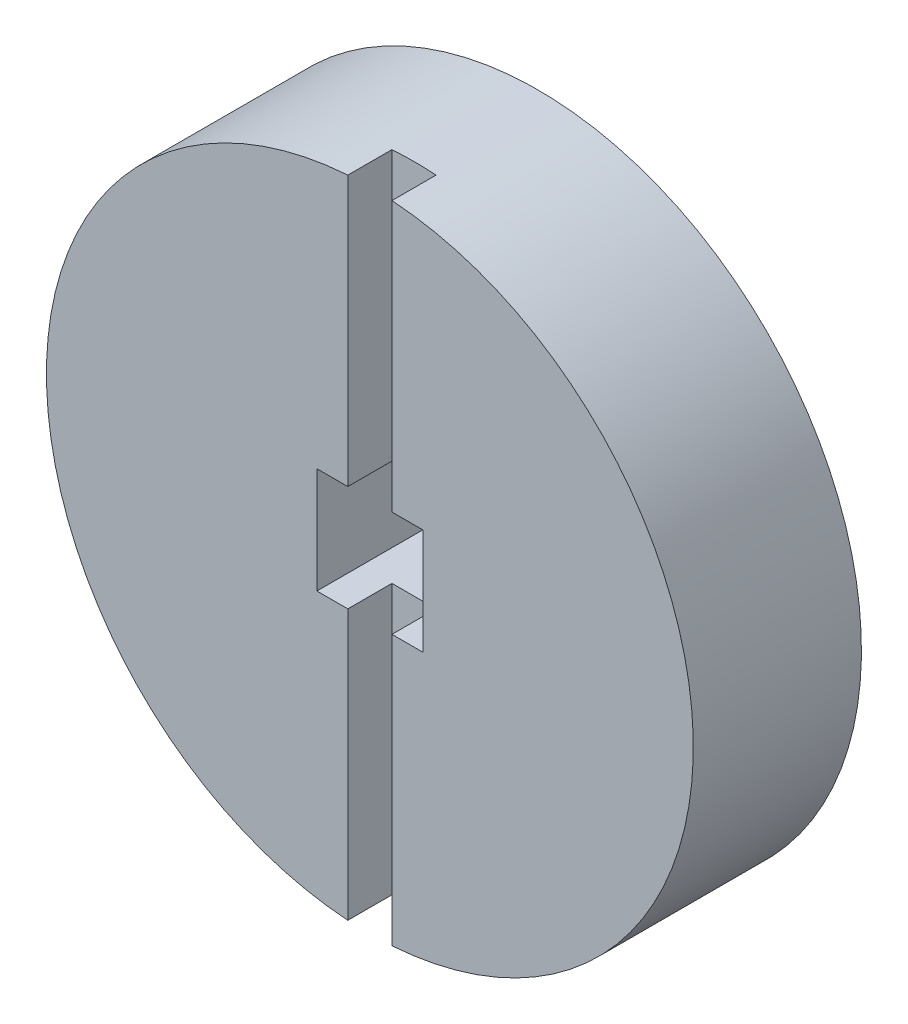
ISO-10303-21;
HEADER;
FILE_DESCRIPTION(('STEP AP214'),'2;1');
FILE_NAME('part.step','',(''),(''),'','','');
FILE_SCHEMA(('AUTOMOTIVE_DESIGN { 1 0 10303 214 1 1 1 1 }'));
ENDSEC;
DATA;
#1=APPLICATION_CONTEXT('core data for automotive mechanical design processes');
#2=APPLICATION_PROTOCOL_DEFINITION('international standard','automotive_design',2000,#1);
#3=PRODUCT_CONTEXT('',#1,'mechanical');
#4=PRODUCT('Part','Part','',(#3));
#5=PRODUCT_RELATED_PRODUCT_CATEGORY('part','',(#4));
#6=PRODUCT_DEFINITION_FORMATION('','',#4);
#7=PRODUCT_DEFINITION_CONTEXT('part definition',#1,'design');
#8=PRODUCT_DEFINITION('design','',#6,#7);
#9=PRODUCT_DEFINITION_SHAPE('','',#8);
#10=(LENGTH_UNIT() NAMED_UNIT(*) SI_UNIT(.MILLI.,.METRE.));
#11=(NAMED_UNIT(*) PLANE_ANGLE_UNIT() SI_UNIT($,.RADIAN.));
#12=(NAMED_UNIT(*) SI_UNIT($,.STERADIAN.) SOLID_ANGLE_UNIT());
#13=UNCERTAINTY_MEASURE_WITH_UNIT(LENGTH_MEASURE(1.E-05),#10,'distance_accuracy_value','');
#14=(GEOMETRIC_REPRESENTATION_CONTEXT(3) GLOBAL_UNCERTAINTY_ASSIGNED_CONTEXT((#13)) GLOBAL_UNIT_ASSIGNED_CONTEXT((#10,
#11,#12)) REPRESENTATION_CONTEXT('',''));
#15=CARTESIAN_POINT('',(0.,0.,0.));
#16=DIRECTION('',(0.,0.,1.));
#17=DIRECTION('',(1.,0.,0.));
#18=AXIS2_PLACEMENT_3D('',#15,#16,#17);
#19=CARTESIAN_POINT('',(24.548886356747,5.38318285887093,-15.875));
#20=DIRECTION('',(0.,0.,-1.));
#21=DIRECTION('',(-1.,0.,0.));
#22=AXIS2_PLACEMENT_3D('',#19,#20,#21);
#23=PLANE('',#22);
#24=CARTESIAN_POINT('',(24.548886356747,5.38318285887093,-15.875));
#25=DIRECTION('',(0.,0.,-1.));
#26=DIRECTION('',(-1.,0.,0.));
#27=AXIS2_PLACEMENT_3D('',#24,#25,#26);
#28=CIRCLE('',#27,7.32907681011146);
#29=CARTESIAN_POINT('',(25.048886356747,12.6951844240044,-15.875));
#30=VERTEX_POINT('',#29);
#31=CARTESIAN_POINT('',(25.048886356747,-1.92881870626249,-15.875));
#32=VERTEX_POINT('',#31);
#33=EDGE_CURVE('E136',#30,#32,#28,.T.);
#34=ORIENTED_EDGE('',*,*,#33,.F.);
#35=DIRECTION('',(0.,1.,0.));
#36=VECTOR('',#35,1.);
#37=CARTESIAN_POINT('',(25.048886356747,16.6967615975721,-15.875));
#38=LINE('',#37,#36);
#39=CARTESIAN_POINT('',(25.048886356747,6.58318285887093,-15.875));
#40=VERTEX_POINT('',#39);
#41=EDGE_CURVE('E140',#40,#30,#38,.T.);
#42=ORIENTED_EDGE('',*,*,#41,.F.);
#43=DIRECTION('',(-1.,0.,0.));
#44=VECTOR('',#43,1.);
#45=CARTESIAN_POINT('',(23.348886356747,6.58318285887093,-15.875));
#46=LINE('',#45,#44);
#47=CARTESIAN_POINT('',(25.748886356747,6.58318285887093,-15.875));
#48=VERTEX_POINT('',#47);
#49=EDGE_CURVE('E174',#48,#40,#46,.T.);
#50=ORIENTED_EDGE('',*,*,#49,.F.);
#51=DIRECTION('',(0.,1.,0.));
#52=VECTOR('',#51,1.);
#53=CARTESIAN_POINT('',(25.748886356747,6.58318285887093,-15.875));
#54=LINE('',#53,#52);
#55=CARTESIAN_POINT('',(25.748886356747,4.18318285887093,-15.875));
#56=VERTEX_POINT('',#55);
#57=EDGE_CURVE('E175',#56,#48,#54,.T.);
#58=ORIENTED_EDGE('',*,*,#57,.F.);
#59=DIRECTION('',(1.,0.,0.));
#60=VECTOR('',#59,1.);
#61=CARTESIAN_POINT('',(23.348886356747,4.18318285887093,-15.875));
#62=LINE('',#61,#60);
#63=CARTESIAN_POINT('',(25.048886356747,4.18318285887093,-15.875));
#64=VERTEX_POINT('',#63);
#65=EDGE_CURVE('E138',#64,#56,#62,.T.);
#66=ORIENTED_EDGE('',*,*,#65,.F.);
#67=EDGE_CURVE('E124',#32,#64,#38,.T.);
#68=ORIENTED_EDGE('',*,*,#67,.F.);
#69=EDGE_LOOP('',(#34,#42,#50,#58,#66,#68));
#70=FACE_BOUND('',#69,.T.);
#71=ADVANCED_FACE('F33',(#70),#23,.F.);
#72=CARTESIAN_POINT('',(24.548886356747,5.38318285887093,-19.695));
#73=DIRECTION('',(0.,0.,1.));
#74=DIRECTION('',(1.,0.,0.));
#75=AXIS2_PLACEMENT_3D('',#72,#73,#74);
#76=CYLINDRICAL_SURFACE('',#75,7.32907681011146);
#77=DIRECTION('',(0.,0.,1.));
#78=VECTOR('',#77,1.);
#79=CARTESIAN_POINT('',(25.048886356747,-1.92881870626249,-19.695));
#80=LINE('',#79,#78);
#81=CARTESIAN_POINT('',(25.048886356747,-1.92881870626249,-16.875));
#82=VERTEX_POINT('',#81);
#83=EDGE_CURVE('E121',#82,#32,#80,.T.);
#84=ORIENTED_EDGE('',*,*,#83,.F.);
#85=CARTESIAN_POINT('',(24.548886356747,5.38318285887093,-16.875));
#86=DIRECTION('',(0.,0.,1.));
#87=DIRECTION('',(1.,0.,0.));
#88=AXIS2_PLACEMENT_3D('',#85,#86,#87);
#89=CIRCLE('',#88,7.32907681011146);
#90=CARTESIAN_POINT('',(24.048886356747,-1.92881870626249,-16.875));
#91=VERTEX_POINT('',#90);
#92=EDGE_CURVE('E216',#82,#91,#89,.F.);
#93=ORIENTED_EDGE('',*,*,#92,.T.);
#94=DIRECTION('',(0.,0.,1.));
#95=VECTOR('',#94,1.);
#96=CARTESIAN_POINT('',(24.048886356747,-1.92881870626249,-19.695));
#97=LINE('',#96,#95);
#98=CARTESIAN_POINT('',(24.048886356747,-1.92881870626249,-15.875));
#99=VERTEX_POINT('',#98);
#100=EDGE_CURVE('E209',#99,#91,#97,.F.);
#101=ORIENTED_EDGE('',*,*,#100,.F.);
#102=CARTESIAN_POINT('',(24.048886356747,12.6951844240044,-15.875));
#103=VERTEX_POINT('',#102);
#104=EDGE_CURVE('E147',#99,#103,#28,.T.);
#105=ORIENTED_EDGE('',*,*,#104,.T.);
#106=DIRECTION('',(0.,0.,1.));
#107=VECTOR('',#106,1.);
#108=CARTESIAN_POINT('',(24.048886356747,12.6951844240044,-19.695));
#109=LINE('',#108,#107);
#110=CARTESIAN_POINT('',(24.048886356747,12.6951844240044,-16.875));
#111=VERTEX_POINT('',#110);
#112=EDGE_CURVE('E211',#111,#103,#109,.T.);
#113=ORIENTED_EDGE('',*,*,#112,.F.);
#114=CARTESIAN_POINT('',(25.048886356747,12.6951844240044,-16.875));
#115=VERTEX_POINT('',#114);
#116=EDGE_CURVE('E217',#111,#115,#89,.F.);
#117=ORIENTED_EDGE('',*,*,#116,.T.);
#118=DIRECTION('',(0.,0.,1.));
#119=VECTOR('',#118,1.);
#120=CARTESIAN_POINT('',(25.048886356747,12.6951844240044,-19.695));
#121=LINE('',#120,#119);
#122=EDGE_CURVE('E129',#30,#115,#121,.F.);
#123=ORIENTED_EDGE('',*,*,#122,.F.);
#124=ORIENTED_EDGE('',*,*,#33,.T.);
#125=EDGE_LOOP('',(#84,#93,#101,#105,#113,#117,#123,#124));
#126=FACE_BOUND('',#125,.T.);
#127=CARTESIAN_POINT('',(24.548886356747,5.38318285887093,-19.685));
#128=DIRECTION('',(0.,0.,-1.));
#129=DIRECTION('',(-1.,0.,0.));
#130=AXIS2_PLACEMENT_3D('',#127,#128,#129);
#131=CIRCLE('',#130,7.32907681011146);
#132=CARTESIAN_POINT('',(17.2198095466355,5.38318285887093,-19.685));
#133=VERTEX_POINT('',#132);
#134=EDGE_CURVE('E146',#133,#133,#131,.T.);
#135=ORIENTED_EDGE('',*,*,#134,.F.);
#136=EDGE_LOOP('',(#135));
#137=FACE_BOUND('',#136,.T.);
#138=ADVANCED_FACE('F143',(#126,#137),#76,.T.);
#139=ORIENTED_EDGE('',*,*,#104,.F.);
#140=DIRECTION('',(0.,-1.,0.));
#141=VECTOR('',#140,1.);
#142=CARTESIAN_POINT('',(24.048886356747,16.6967615975721,-15.875));
#143=LINE('',#142,#141);
#144=CARTESIAN_POINT('',(24.048886356747,4.18318285887093,-15.875));
#145=VERTEX_POINT('',#144);
#146=EDGE_CURVE('E139',#145,#99,#143,.T.);
#147=ORIENTED_EDGE('',*,*,#146,.F.);
#148=CARTESIAN_POINT('',(23.348886356747,4.18318285887093,-15.875));
#149=VERTEX_POINT('',#148);
#150=EDGE_CURVE('E181',#149,#145,#62,.T.);
#151=ORIENTED_EDGE('',*,*,#150,.F.);
#152=DIRECTION('',(0.,-1.,0.));
#153=VECTOR('',#152,1.);
#154=CARTESIAN_POINT('',(23.348886356747,6.58318285887093,-15.875));
#155=LINE('',#154,#153);
#156=CARTESIAN_POINT('',(23.348886356747,6.58318285887093,-15.875));
#157=VERTEX_POINT('',#156);
#158=EDGE_CURVE('E173',#157,#149,#155,.T.);
#159=ORIENTED_EDGE('',*,*,#158,.F.);
#160=CARTESIAN_POINT('',(24.048886356747,6.58318285887093,-15.875));
#161=VERTEX_POINT('',#160);
#162=EDGE_CURVE('E162',#161,#157,#46,.T.);
#163=ORIENTED_EDGE('',*,*,#162,.F.);
#164=EDGE_CURVE('E170',#103,#161,#143,.T.);
#165=ORIENTED_EDGE('',*,*,#164,.F.);
#166=EDGE_LOOP('',(#139,#147,#151,#159,#163,#165));
#167=FACE_BOUND('',#166,.T.);
#168=ADVANCED_FACE('F169',(#167),#23,.F.);
#169=CARTESIAN_POINT('',(24.548886356747,5.38318285887093,-19.685));
#170=DIRECTION('',(0.,0.,-1.));
#171=DIRECTION('',(-1.,0.,0.));
#172=AXIS2_PLACEMENT_3D('',#169,#170,#171);
#173=PLANE('',#172);
#174=ORIENTED_EDGE('',*,*,#134,.T.);
#175=EDGE_LOOP('',(#174));
#176=FACE_BOUND('',#175,.T.);
#177=ADVANCED_FACE('F35',(#176),#173,.T.);
#178=CARTESIAN_POINT('',(25.748886356747,6.58318285887093,-18.796));
#179=DIRECTION('',(1.,0.,0.));
#180=DIRECTION('',(0.,0.,-1.));
#181=AXIS2_PLACEMENT_3D('',#178,#179,#180);
#182=PLANE('',#181);
#183=ORIENTED_EDGE('',*,*,#57,.T.);
#184=DIRECTION('',(0.,0.,1.));
#185=VECTOR('',#184,1.);
#186=CARTESIAN_POINT('',(25.748886356747,6.58318285887093,-18.796));
#187=LINE('',#186,#185);
#188=CARTESIAN_POINT('',(25.748886356747,6.58318285887093,-18.796));
#189=VERTEX_POINT('',#188);
#190=EDGE_CURVE('E190',#189,#48,#187,.T.);
#191=ORIENTED_EDGE('',*,*,#190,.F.);
#192=DIRECTION('',(0.,1.,0.));
#193=VECTOR('',#192,1.);
#194=CARTESIAN_POINT('',(25.748886356747,6.58318285887093,-18.796));
#195=LINE('',#194,#193);
#196=CARTESIAN_POINT('',(25.748886356747,4.18318285887093,-18.796));
#197=VERTEX_POINT('',#196);
#198=EDGE_CURVE('E184',#197,#189,#195,.T.);
#199=ORIENTED_EDGE('',*,*,#198,.F.);
#200=DIRECTION('',(0.,0.,1.));
#201=VECTOR('',#200,1.);
#202=CARTESIAN_POINT('',(25.748886356747,4.18318285887093,-18.796));
#203=LINE('',#202,#201);
#204=EDGE_CURVE('E153',#197,#56,#203,.T.);
#205=ORIENTED_EDGE('',*,*,#204,.T.);
#206=EDGE_LOOP('',(#183,#191,#199,#205));
#207=FACE_BOUND('',#206,.T.);
#208=ADVANCED_FACE('F242',(#207),#182,.F.);
#209=CARTESIAN_POINT('',(23.348886356747,4.18318285887093,-18.796));
#210=DIRECTION('',(0.,-1.,0.));
#211=DIRECTION('',(0.,0.,-1.));
#212=AXIS2_PLACEMENT_3D('',#209,#210,#211);
#213=PLANE('',#212);
#214=DIRECTION('',(-1.,0.,0.));
#215=VECTOR('',#214,1.);
#216=CARTESIAN_POINT('',(23.348886356747,4.18318285887093,-16.875));
#217=LINE('',#216,#215);
#218=CARTESIAN_POINT('',(25.048886356747,4.18318285887093,-16.875));
#219=VERTEX_POINT('',#218);
#220=CARTESIAN_POINT('',(24.048886356747,4.18318285887093,-16.875));
#221=VERTEX_POINT('',#220);
#222=EDGE_CURVE('E219',#219,#221,#217,.T.);
#223=ORIENTED_EDGE('',*,*,#222,.F.);
#224=DIRECTION('',(0.,0.,1.));
#225=VECTOR('',#224,1.);
#226=CARTESIAN_POINT('',(25.048886356747,4.18318285887093,-18.796));
#227=LINE('',#226,#225);
#228=EDGE_CURVE('E130',#219,#64,#227,.T.);
#229=ORIENTED_EDGE('',*,*,#228,.T.);
#230=ORIENTED_EDGE('',*,*,#65,.T.);
#231=ORIENTED_EDGE('',*,*,#204,.F.);
#232=DIRECTION('',(1.,0.,0.));
#233=VECTOR('',#232,1.);
#234=CARTESIAN_POINT('',(23.348886356747,4.18318285887093,-18.796));
#235=LINE('',#234,#233);
#236=CARTESIAN_POINT('',(23.348886356747,4.18318285887093,-18.796));
#237=VERTEX_POINT('',#236);
#238=EDGE_CURVE('E192',#237,#197,#235,.T.);
#239=ORIENTED_EDGE('',*,*,#238,.F.);
#240=DIRECTION('',(0.,0.,1.));
#241=VECTOR('',#240,1.);
#242=CARTESIAN_POINT('',(23.348886356747,4.18318285887093,-18.796));
#243=LINE('',#242,#241);
#244=EDGE_CURVE('E187',#237,#149,#243,.T.);
#245=ORIENTED_EDGE('',*,*,#244,.T.);
#246=ORIENTED_EDGE('',*,*,#150,.T.);
#247=DIRECTION('',(0.,0.,-1.));
#248=VECTOR('',#247,1.);
#249=CARTESIAN_POINT('',(24.048886356747,4.18318285887093,-18.796));
#250=LINE('',#249,#248);
#251=EDGE_CURVE('E213',#145,#221,#250,.T.);
#252=ORIENTED_EDGE('',*,*,#251,.T.);
#253=EDGE_LOOP('',(#223,#229,#230,#231,#239,#245,#246,#252));
#254=FACE_BOUND('',#253,.T.);
#255=ADVANCED_FACE('F235',(#254),#213,.F.);
#256=CARTESIAN_POINT('',(23.348886356747,6.58318285887093,-18.796));
#257=DIRECTION('',(-1.,0.,0.));
#258=DIRECTION('',(0.,0.,1.));
#259=AXIS2_PLACEMENT_3D('',#256,#257,#258);
#260=PLANE('',#259);
#261=ORIENTED_EDGE('',*,*,#158,.T.);
#262=ORIENTED_EDGE('',*,*,#244,.F.);
#263=DIRECTION('',(0.,-1.,0.));
#264=VECTOR('',#263,1.);
#265=CARTESIAN_POINT('',(23.348886356747,6.58318285887093,-18.796));
#266=LINE('',#265,#264);
#267=CARTESIAN_POINT('',(23.348886356747,6.58318285887093,-18.796));
#268=VERTEX_POINT('',#267);
#269=EDGE_CURVE('E196',#268,#237,#266,.T.);
#270=ORIENTED_EDGE('',*,*,#269,.F.);
#271=DIRECTION('',(0.,0.,1.));
#272=VECTOR('',#271,1.);
#273=CARTESIAN_POINT('',(23.348886356747,6.58318285887093,-18.796));
#274=LINE('',#273,#272);
#275=EDGE_CURVE('E189',#268,#157,#274,.T.);
#276=ORIENTED_EDGE('',*,*,#275,.T.);
#277=EDGE_LOOP('',(#261,#262,#270,#276));
#278=FACE_BOUND('',#277,.T.);
#279=ADVANCED_FACE('F238',(#278),#260,.F.);
#280=CARTESIAN_POINT('',(23.348886356747,6.58318285887093,-18.796));
#281=DIRECTION('',(0.,1.,0.));
#282=DIRECTION('',(0.,0.,1.));
#283=AXIS2_PLACEMENT_3D('',#280,#281,#282);
#284=PLANE('',#283);
#285=ORIENTED_EDGE('',*,*,#49,.T.);
#286=DIRECTION('',(0.,0.,-1.));
#287=VECTOR('',#286,1.);
#288=CARTESIAN_POINT('',(25.048886356747,6.58318285887093,-18.796));
#289=LINE('',#288,#287);
#290=CARTESIAN_POINT('',(25.048886356747,6.58318285887093,-16.875));
#291=VERTEX_POINT('',#290);
#292=EDGE_CURVE('E11',#40,#291,#289,.T.);
#293=ORIENTED_EDGE('',*,*,#292,.T.);
#294=DIRECTION('',(1.,0.,0.));
#295=VECTOR('',#294,1.);
#296=CARTESIAN_POINT('',(23.348886356747,6.58318285887093,-16.875));
#297=LINE('',#296,#295);
#298=CARTESIAN_POINT('',(24.048886356747,6.58318285887093,-16.875));
#299=VERTEX_POINT('',#298);
#300=EDGE_CURVE('E150',#299,#291,#297,.T.);
#301=ORIENTED_EDGE('',*,*,#300,.F.);
#302=DIRECTION('',(0.,0.,1.));
#303=VECTOR('',#302,1.);
#304=CARTESIAN_POINT('',(24.048886356747,6.58318285887093,-18.796));
#305=LINE('',#304,#303);
#306=EDGE_CURVE('E41',#299,#161,#305,.T.);
#307=ORIENTED_EDGE('',*,*,#306,.T.);
#308=ORIENTED_EDGE('',*,*,#162,.T.);
#309=ORIENTED_EDGE('',*,*,#275,.F.);
#310=DIRECTION('',(-1.,0.,0.));
#311=VECTOR('',#310,1.);
#312=CARTESIAN_POINT('',(23.348886356747,6.58318285887093,-18.796));
#313=LINE('',#312,#311);
#314=EDGE_CURVE('E201',#189,#268,#313,.T.);
#315=ORIENTED_EDGE('',*,*,#314,.F.);
#316=ORIENTED_EDGE('',*,*,#190,.T.);
#317=EDGE_LOOP('',(#285,#293,#301,#307,#308,#309,#315,#316));
#318=FACE_BOUND('',#317,.T.);
#319=ADVANCED_FACE('F161',(#318),#284,.F.);
#320=CARTESIAN_POINT('',(0.,0.,-18.796));
#321=DIRECTION('',(0.,0.,1.));
#322=DIRECTION('',(1.,0.,0.));
#323=AXIS2_PLACEMENT_3D('',#320,#321,#322);
#324=PLANE('',#323);
#325=ORIENTED_EDGE('',*,*,#198,.T.);
#326=ORIENTED_EDGE('',*,*,#314,.T.);
#327=ORIENTED_EDGE('',*,*,#269,.T.);
#328=ORIENTED_EDGE('',*,*,#238,.T.);
#329=EDGE_LOOP('',(#325,#326,#327,#328));
#330=FACE_BOUND('',#329,.T.);
#331=ADVANCED_FACE('F240',(#330),#324,.T.);
#332=CARTESIAN_POINT('',(0.,0.,-16.875));
#333=DIRECTION('',(0.,0.,1.));
#334=DIRECTION('',(1.,0.,0.));
#335=AXIS2_PLACEMENT_3D('',#332,#333,#334);
#336=PLANE('',#335);
#337=DIRECTION('',(0.,-1.,0.));
#338=VECTOR('',#337,1.);
#339=CARTESIAN_POINT('',(24.048886356747,16.6967615975721,-16.875));
#340=LINE('',#339,#338);
#341=EDGE_CURVE('E56',#111,#299,#340,.T.);
#342=ORIENTED_EDGE('',*,*,#341,.T.);
#343=ORIENTED_EDGE('',*,*,#300,.T.);
#344=DIRECTION('',(0.,1.,0.));
#345=VECTOR('',#344,1.);
#346=CARTESIAN_POINT('',(25.048886356747,16.6967615975721,-16.875));
#347=LINE('',#346,#345);
#348=EDGE_CURVE('E225',#291,#115,#347,.T.);
#349=ORIENTED_EDGE('',*,*,#348,.T.);
#350=ORIENTED_EDGE('',*,*,#116,.F.);
#351=EDGE_LOOP('',(#342,#343,#349,#350));
#352=FACE_BOUND('',#351,.T.);
#353=ADVANCED_FACE('F252',(#352),#336,.T.);
#354=CARTESIAN_POINT('',(24.048886356747,16.6967615975721,-16.875));
#355=DIRECTION('',(-1.,0.,0.));
#356=DIRECTION('',(0.,-1.,0.));
#357=AXIS2_PLACEMENT_3D('',#354,#355,#356);
#358=PLANE('',#357);
#359=ORIENTED_EDGE('',*,*,#112,.T.);
#360=ORIENTED_EDGE('',*,*,#164,.T.);
#361=ORIENTED_EDGE('',*,*,#306,.F.);
#362=ORIENTED_EDGE('',*,*,#341,.F.);
#363=EDGE_LOOP('',(#359,#360,#361,#362));
#364=FACE_BOUND('',#363,.T.);
#365=ADVANCED_FACE('F228',(#364),#358,.F.);
#366=CARTESIAN_POINT('',(25.048886356747,16.6967615975721,-16.875));
#367=DIRECTION('',(1.,0.,0.));
#368=DIRECTION('',(0.,1.,0.));
#369=AXIS2_PLACEMENT_3D('',#366,#367,#368);
#370=PLANE('',#369);
#371=ORIENTED_EDGE('',*,*,#122,.T.);
#372=ORIENTED_EDGE('',*,*,#348,.F.);
#373=ORIENTED_EDGE('',*,*,#292,.F.);
#374=ORIENTED_EDGE('',*,*,#41,.T.);
#375=EDGE_LOOP('',(#371,#372,#373,#374));
#376=FACE_BOUND('',#375,.T.);
#377=ADVANCED_FACE('F244',(#376),#370,.F.);
#378=ORIENTED_EDGE('',*,*,#83,.T.);
#379=ORIENTED_EDGE('',*,*,#67,.T.);
#380=ORIENTED_EDGE('',*,*,#228,.F.);
#381=EDGE_CURVE('E48',#82,#219,#347,.T.);
#382=ORIENTED_EDGE('',*,*,#381,.F.);
#383=EDGE_LOOP('',(#378,#379,#380,#382));
#384=FACE_BOUND('',#383,.T.);
#385=ADVANCED_FACE('F123',(#384),#370,.F.);
#386=ORIENTED_EDGE('',*,*,#100,.T.);
#387=EDGE_CURVE('E222',#221,#91,#340,.T.);
#388=ORIENTED_EDGE('',*,*,#387,.F.);
#389=ORIENTED_EDGE('',*,*,#251,.F.);
#390=ORIENTED_EDGE('',*,*,#146,.T.);
#391=EDGE_LOOP('',(#386,#388,#389,#390));
#392=FACE_BOUND('',#391,.T.);
#393=ADVANCED_FACE('F251',(#392),#358,.F.);
#394=ORIENTED_EDGE('',*,*,#381,.T.);
#395=ORIENTED_EDGE('',*,*,#222,.T.);
#396=ORIENTED_EDGE('',*,*,#387,.T.);
#397=ORIENTED_EDGE('',*,*,#92,.F.);
#398=EDGE_LOOP('',(#394,#395,#396,#397));
#399=FACE_BOUND('',#398,.T.);
#400=ADVANCED_FACE('F283',(#399),#336,.T.);
#401=CLOSED_SHELL('',(#71,#138,#168,#177,#208,#255,#279,#319,#331,#353,#365,#377,#385,#393,#400));
#402=MANIFOLD_SOLID_BREP('B2',#401);
#403=ADVANCED_BREP_SHAPE_REPRESENTATION('',(#18,#402),#14);
#404=SHAPE_DEFINITION_REPRESENTATION(#9,#403);
ENDSEC;
END-ISO-10303-21;
